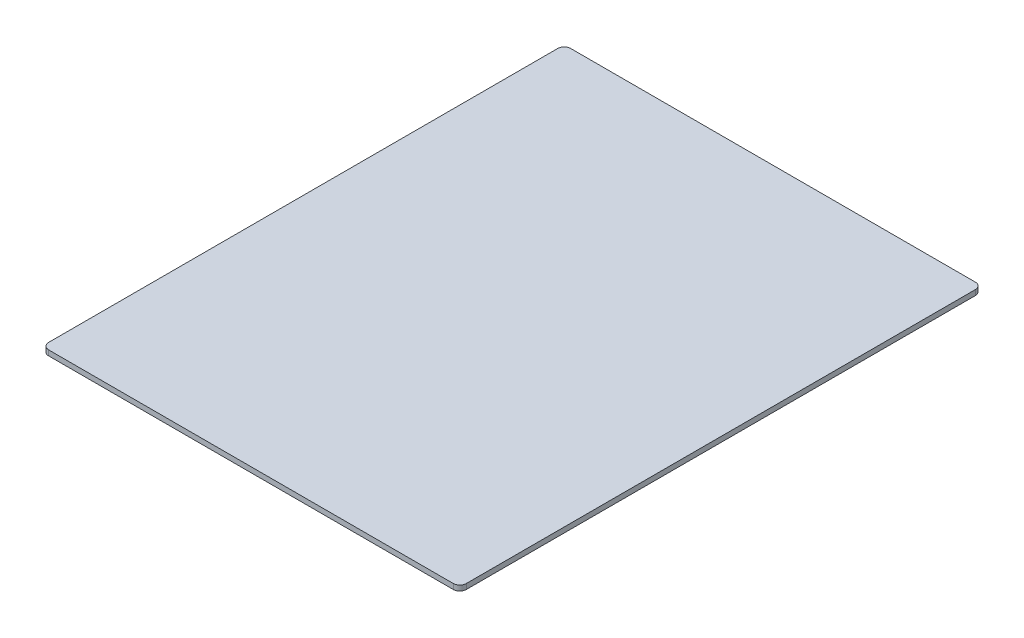
ISO-10303-21;
HEADER;
FILE_DESCRIPTION(('STEP AP214'),'2;1');
FILE_NAME('part.step','',(''),(''),'','','');
FILE_SCHEMA(('AUTOMOTIVE_DESIGN { 1 0 10303 214 1 1 1 1 }'));
ENDSEC;
DATA;
#1=APPLICATION_CONTEXT('core data for automotive mechanical design processes');
#2=APPLICATION_PROTOCOL_DEFINITION('international standard','automotive_design',2000,#1);
#3=PRODUCT_CONTEXT('',#1,'mechanical');
#4=PRODUCT('Part','Part','',(#3));
#5=PRODUCT_RELATED_PRODUCT_CATEGORY('part','',(#4));
#6=PRODUCT_DEFINITION_FORMATION('','',#4);
#7=PRODUCT_DEFINITION_CONTEXT('part definition',#1,'design');
#8=PRODUCT_DEFINITION('design','',#6,#7);
#9=PRODUCT_DEFINITION_SHAPE('','',#8);
#10=(LENGTH_UNIT() NAMED_UNIT(*) SI_UNIT(.MILLI.,.METRE.));
#11=(NAMED_UNIT(*) PLANE_ANGLE_UNIT() SI_UNIT($,.RADIAN.));
#12=(NAMED_UNIT(*) SI_UNIT($,.STERADIAN.) SOLID_ANGLE_UNIT());
#13=UNCERTAINTY_MEASURE_WITH_UNIT(LENGTH_MEASURE(1.E-05),#10,'distance_accuracy_value','');
#14=(GEOMETRIC_REPRESENTATION_CONTEXT(3) GLOBAL_UNCERTAINTY_ASSIGNED_CONTEXT((#13)) GLOBAL_UNIT_ASSIGNED_CONTEXT((#10,
#11,#12)) REPRESENTATION_CONTEXT('',''));
#15=CARTESIAN_POINT('',(0.,0.,0.));
#16=DIRECTION('',(0.,0.,1.));
#17=DIRECTION('',(1.,0.,0.));
#18=AXIS2_PLACEMENT_3D('',#15,#16,#17);
#19=CARTESIAN_POINT('',(-80.,2.,100.));
#20=DIRECTION('',(1.,0.,0.));
#21=DIRECTION('',(0.,0.,-1.));
#22=AXIS2_PLACEMENT_3D('',#19,#20,#21);
#23=PLANE('',#22);
#24=DIRECTION('',(0.,0.,1.));
#25=VECTOR('',#24,1.);
#26=CARTESIAN_POINT('',(-80.,2.,100.));
#27=LINE('',#26,#25);
#28=CARTESIAN_POINT('',(-80.,2.,-97.5));
#29=VERTEX_POINT('',#28);
#30=CARTESIAN_POINT('',(-80.,2.,97.5));
#31=VERTEX_POINT('',#30);
#32=EDGE_CURVE('E120',#29,#31,#27,.T.);
#33=ORIENTED_EDGE('',*,*,#32,.F.);
#34=DIRECTION('',(0.,-1.,0.));
#35=VECTOR('',#34,1.);
#36=CARTESIAN_POINT('',(-80.,2.,-97.5));
#37=LINE('',#36,#35);
#38=CARTESIAN_POINT('',(-80.,0.,-97.5));
#39=VERTEX_POINT('',#38);
#40=EDGE_CURVE('E105',#29,#39,#37,.T.);
#41=ORIENTED_EDGE('',*,*,#40,.T.);
#42=DIRECTION('',(0.,0.,1.));
#43=VECTOR('',#42,1.);
#44=CARTESIAN_POINT('',(-80.,0.,100.));
#45=LINE('',#44,#43);
#46=CARTESIAN_POINT('',(-80.,0.,97.5));
#47=VERTEX_POINT('',#46);
#48=EDGE_CURVE('E117',#39,#47,#45,.T.);
#49=ORIENTED_EDGE('',*,*,#48,.T.);
#50=DIRECTION('',(0.,-1.,0.));
#51=VECTOR('',#50,1.);
#52=CARTESIAN_POINT('',(-80.,2.,97.5));
#53=LINE('',#52,#51);
#54=EDGE_CURVE('E122',#47,#31,#53,.F.);
#55=ORIENTED_EDGE('',*,*,#54,.T.);
#56=EDGE_LOOP('',(#33,#41,#49,#55));
#57=FACE_BOUND('',#56,.T.);
#58=ADVANCED_FACE('F35',(#57),#23,.F.);
#59=CARTESIAN_POINT('',(80.,2.,100.));
#60=DIRECTION('',(0.,0.,-1.));
#61=DIRECTION('',(-1.,0.,0.));
#62=AXIS2_PLACEMENT_3D('',#59,#60,#61);
#63=PLANE('',#62);
#64=DIRECTION('',(1.,0.,0.));
#65=VECTOR('',#64,1.);
#66=CARTESIAN_POINT('',(80.,0.,100.));
#67=LINE('',#66,#65);
#68=CARTESIAN_POINT('',(-77.5,0.,100.));
#69=VERTEX_POINT('',#68);
#70=CARTESIAN_POINT('',(77.5,0.,100.));
#71=VERTEX_POINT('',#70);
#72=EDGE_CURVE('E126',#69,#71,#67,.T.);
#73=ORIENTED_EDGE('',*,*,#72,.T.);
#74=DIRECTION('',(0.,-1.,0.));
#75=VECTOR('',#74,1.);
#76=CARTESIAN_POINT('',(77.5,2.,100.));
#77=LINE('',#76,#75);
#78=CARTESIAN_POINT('',(77.5,2.,100.));
#79=VERTEX_POINT('',#78);
#80=EDGE_CURVE('E11',#71,#79,#77,.F.);
#81=ORIENTED_EDGE('',*,*,#80,.T.);
#82=DIRECTION('',(1.,0.,0.));
#83=VECTOR('',#82,1.);
#84=CARTESIAN_POINT('',(80.,2.,100.));
#85=LINE('',#84,#83);
#86=CARTESIAN_POINT('',(-77.5,2.,100.));
#87=VERTEX_POINT('',#86);
#88=EDGE_CURVE('E162',#87,#79,#85,.T.);
#89=ORIENTED_EDGE('',*,*,#88,.F.);
#90=DIRECTION('',(0.,-1.,0.));
#91=VECTOR('',#90,1.);
#92=CARTESIAN_POINT('',(-77.5,2.,100.));
#93=LINE('',#92,#91);
#94=EDGE_CURVE('E43',#87,#69,#93,.T.);
#95=ORIENTED_EDGE('',*,*,#94,.T.);
#96=EDGE_LOOP('',(#73,#81,#89,#95));
#97=FACE_BOUND('',#96,.T.);
#98=ADVANCED_FACE('F160',(#97),#63,.F.);
#99=CARTESIAN_POINT('',(80.,2.,100.));
#100=DIRECTION('',(-1.,0.,0.));
#101=DIRECTION('',(0.,0.,1.));
#102=AXIS2_PLACEMENT_3D('',#99,#100,#101);
#103=PLANE('',#102);
#104=DIRECTION('',(0.,0.,-1.));
#105=VECTOR('',#104,1.);
#106=CARTESIAN_POINT('',(80.,0.,100.));
#107=LINE('',#106,#105);
#108=CARTESIAN_POINT('',(80.,0.,97.5));
#109=VERTEX_POINT('',#108);
#110=CARTESIAN_POINT('',(80.,0.,-97.5));
#111=VERTEX_POINT('',#110);
#112=EDGE_CURVE('E129',#109,#111,#107,.T.);
#113=ORIENTED_EDGE('',*,*,#112,.T.);
#114=DIRECTION('',(0.,-1.,0.));
#115=VECTOR('',#114,1.);
#116=CARTESIAN_POINT('',(80.,2.,-97.5));
#117=LINE('',#116,#115);
#118=CARTESIAN_POINT('',(80.,2.,-97.5));
#119=VERTEX_POINT('',#118);
#120=EDGE_CURVE('E50',#111,#119,#117,.F.);
#121=ORIENTED_EDGE('',*,*,#120,.T.);
#122=DIRECTION('',(0.,0.,-1.));
#123=VECTOR('',#122,1.);
#124=CARTESIAN_POINT('',(80.,2.,100.));
#125=LINE('',#124,#123);
#126=CARTESIAN_POINT('',(80.,2.,97.5));
#127=VERTEX_POINT('',#126);
#128=EDGE_CURVE('E170',#127,#119,#125,.T.);
#129=ORIENTED_EDGE('',*,*,#128,.F.);
#130=DIRECTION('',(0.,-1.,0.));
#131=VECTOR('',#130,1.);
#132=CARTESIAN_POINT('',(80.,2.,97.5));
#133=LINE('',#132,#131);
#134=EDGE_CURVE('E153',#127,#109,#133,.T.);
#135=ORIENTED_EDGE('',*,*,#134,.T.);
#136=EDGE_LOOP('',(#113,#121,#129,#135));
#137=FACE_BOUND('',#136,.T.);
#138=ADVANCED_FACE('F169',(#137),#103,.F.);
#139=CARTESIAN_POINT('',(80.,2.,-100.));
#140=DIRECTION('',(0.,0.,1.));
#141=DIRECTION('',(1.,0.,0.));
#142=AXIS2_PLACEMENT_3D('',#139,#140,#141);
#143=PLANE('',#142);
#144=DIRECTION('',(-1.,0.,0.));
#145=VECTOR('',#144,1.);
#146=CARTESIAN_POINT('',(80.,0.,-100.));
#147=LINE('',#146,#145);
#148=CARTESIAN_POINT('',(77.5,0.,-100.));
#149=VERTEX_POINT('',#148);
#150=CARTESIAN_POINT('',(-77.5,0.,-100.));
#151=VERTEX_POINT('',#150);
#152=EDGE_CURVE('E136',#149,#151,#147,.T.);
#153=ORIENTED_EDGE('',*,*,#152,.T.);
#154=DIRECTION('',(0.,-1.,0.));
#155=VECTOR('',#154,1.);
#156=CARTESIAN_POINT('',(-77.5,2.,-100.));
#157=LINE('',#156,#155);
#158=CARTESIAN_POINT('',(-77.5,2.,-100.));
#159=VERTEX_POINT('',#158);
#160=EDGE_CURVE('E106',#151,#159,#157,.F.);
#161=ORIENTED_EDGE('',*,*,#160,.T.);
#162=DIRECTION('',(-1.,0.,0.));
#163=VECTOR('',#162,1.);
#164=CARTESIAN_POINT('',(80.,2.,-100.));
#165=LINE('',#164,#163);
#166=CARTESIAN_POINT('',(77.5,2.,-100.));
#167=VERTEX_POINT('',#166);
#168=EDGE_CURVE('E132',#167,#159,#165,.T.);
#169=ORIENTED_EDGE('',*,*,#168,.F.);
#170=DIRECTION('',(0.,-1.,0.));
#171=VECTOR('',#170,1.);
#172=CARTESIAN_POINT('',(77.5,2.,-100.));
#173=LINE('',#172,#171);
#174=EDGE_CURVE('E111',#167,#149,#173,.T.);
#175=ORIENTED_EDGE('',*,*,#174,.T.);
#176=EDGE_LOOP('',(#153,#161,#169,#175));
#177=FACE_BOUND('',#176,.T.);
#178=ADVANCED_FACE('F198',(#177),#143,.F.);
#179=CARTESIAN_POINT('',(0.,2.,0.));
#180=DIRECTION('',(0.,1.,0.));
#181=DIRECTION('',(0.,0.,1.));
#182=AXIS2_PLACEMENT_3D('',#179,#180,#181);
#183=PLANE('',#182);
#184=ORIENTED_EDGE('',*,*,#168,.T.);
#185=CARTESIAN_POINT('',(-77.5,2.,-97.5));
#186=DIRECTION('',(0.,1.,0.));
#187=DIRECTION('',(0.,0.,1.));
#188=AXIS2_PLACEMENT_3D('',#185,#186,#187);
#189=CIRCLE('',#188,2.5);
#190=EDGE_CURVE('E151',#159,#29,#189,.T.);
#191=ORIENTED_EDGE('',*,*,#190,.T.);
#192=ORIENTED_EDGE('',*,*,#32,.T.);
#193=CARTESIAN_POINT('',(-77.5,2.,97.5));
#194=DIRECTION('',(0.,1.,0.));
#195=DIRECTION('',(0.,0.,1.));
#196=AXIS2_PLACEMENT_3D('',#193,#194,#195);
#197=CIRCLE('',#196,2.5);
#198=EDGE_CURVE('E146',#31,#87,#197,.T.);
#199=ORIENTED_EDGE('',*,*,#198,.T.);
#200=ORIENTED_EDGE('',*,*,#88,.T.);
#201=CARTESIAN_POINT('',(77.5,2.,97.5));
#202=DIRECTION('',(0.,1.,0.));
#203=DIRECTION('',(0.,0.,1.));
#204=AXIS2_PLACEMENT_3D('',#201,#202,#203);
#205=CIRCLE('',#204,2.5);
#206=EDGE_CURVE('E57',#79,#127,#205,.T.);
#207=ORIENTED_EDGE('',*,*,#206,.T.);
#208=ORIENTED_EDGE('',*,*,#128,.T.);
#209=CARTESIAN_POINT('',(77.5,2.,-97.5));
#210=DIRECTION('',(0.,1.,0.));
#211=DIRECTION('',(0.,0.,1.));
#212=AXIS2_PLACEMENT_3D('',#209,#210,#211);
#213=CIRCLE('',#212,2.5);
#214=EDGE_CURVE('E149',#119,#167,#213,.T.);
#215=ORIENTED_EDGE('',*,*,#214,.T.);
#216=EDGE_LOOP('',(#184,#191,#192,#199,#200,#207,#208,#215));
#217=FACE_BOUND('',#216,.T.);
#218=ADVANCED_FACE('F175',(#217),#183,.T.);
#219=CARTESIAN_POINT('',(0.,0.,0.));
#220=DIRECTION('',(0.,1.,0.));
#221=DIRECTION('',(0.,0.,1.));
#222=AXIS2_PLACEMENT_3D('',#219,#220,#221);
#223=PLANE('',#222);
#224=ORIENTED_EDGE('',*,*,#48,.F.);
#225=CARTESIAN_POINT('',(-77.5,0.,-97.5));
#226=DIRECTION('',(0.,1.,0.));
#227=DIRECTION('',(0.,0.,1.));
#228=AXIS2_PLACEMENT_3D('',#225,#226,#227);
#229=CIRCLE('',#228,2.5);
#230=EDGE_CURVE('E101',#39,#151,#229,.F.);
#231=ORIENTED_EDGE('',*,*,#230,.T.);
#232=ORIENTED_EDGE('',*,*,#152,.F.);
#233=CARTESIAN_POINT('',(77.5,0.,-97.5));
#234=DIRECTION('',(0.,1.,0.));
#235=DIRECTION('',(0.,0.,1.));
#236=AXIS2_PLACEMENT_3D('',#233,#234,#235);
#237=CIRCLE('',#236,2.5);
#238=EDGE_CURVE('E112',#149,#111,#237,.F.);
#239=ORIENTED_EDGE('',*,*,#238,.T.);
#240=ORIENTED_EDGE('',*,*,#112,.F.);
#241=CARTESIAN_POINT('',(77.5,0.,97.5));
#242=DIRECTION('',(0.,1.,0.));
#243=DIRECTION('',(0.,0.,1.));
#244=AXIS2_PLACEMENT_3D('',#241,#242,#243);
#245=CIRCLE('',#244,2.5);
#246=EDGE_CURVE('E140',#109,#71,#245,.F.);
#247=ORIENTED_EDGE('',*,*,#246,.T.);
#248=ORIENTED_EDGE('',*,*,#72,.F.);
#249=CARTESIAN_POINT('',(-77.5,0.,97.5));
#250=DIRECTION('',(0.,1.,0.));
#251=DIRECTION('',(0.,0.,1.));
#252=AXIS2_PLACEMENT_3D('',#249,#250,#251);
#253=CIRCLE('',#252,2.5);
#254=EDGE_CURVE('E121',#69,#47,#253,.F.);
#255=ORIENTED_EDGE('',*,*,#254,.T.);
#256=EDGE_LOOP('',(#224,#231,#232,#239,#240,#247,#248,#255));
#257=FACE_BOUND('',#256,.T.);
#258=ADVANCED_FACE('F124',(#257),#223,.F.);
#259=CARTESIAN_POINT('',(-77.5,2.,-97.5));
#260=DIRECTION('',(0.,-1.,0.));
#261=DIRECTION('',(0.,0.,-1.));
#262=AXIS2_PLACEMENT_3D('',#259,#260,#261);
#263=CYLINDRICAL_SURFACE('',#262,2.5);
#264=ORIENTED_EDGE('',*,*,#190,.F.);
#265=ORIENTED_EDGE('',*,*,#160,.F.);
#266=ORIENTED_EDGE('',*,*,#230,.F.);
#267=ORIENTED_EDGE('',*,*,#40,.F.);
#268=EDGE_LOOP('',(#264,#265,#266,#267));
#269=FACE_BOUND('',#268,.T.);
#270=ADVANCED_FACE('F104',(#269),#263,.T.);
#271=CARTESIAN_POINT('',(77.5,2.,-97.5));
#272=DIRECTION('',(0.,-1.,0.));
#273=DIRECTION('',(0.,0.,-1.));
#274=AXIS2_PLACEMENT_3D('',#271,#272,#273);
#275=CYLINDRICAL_SURFACE('',#274,2.5);
#276=ORIENTED_EDGE('',*,*,#214,.F.);
#277=ORIENTED_EDGE('',*,*,#120,.F.);
#278=ORIENTED_EDGE('',*,*,#238,.F.);
#279=ORIENTED_EDGE('',*,*,#174,.F.);
#280=EDGE_LOOP('',(#276,#277,#278,#279));
#281=FACE_BOUND('',#280,.T.);
#282=ADVANCED_FACE('F180',(#281),#275,.T.);
#283=CARTESIAN_POINT('',(77.5,2.,97.5));
#284=DIRECTION('',(0.,-1.,0.));
#285=DIRECTION('',(0.,0.,-1.));
#286=AXIS2_PLACEMENT_3D('',#283,#284,#285);
#287=CYLINDRICAL_SURFACE('',#286,2.5);
#288=ORIENTED_EDGE('',*,*,#206,.F.);
#289=ORIENTED_EDGE('',*,*,#80,.F.);
#290=ORIENTED_EDGE('',*,*,#246,.F.);
#291=ORIENTED_EDGE('',*,*,#134,.F.);
#292=EDGE_LOOP('',(#288,#289,#290,#291));
#293=FACE_BOUND('',#292,.T.);
#294=ADVANCED_FACE('F168',(#293),#287,.T.);
#295=CARTESIAN_POINT('',(-77.5,2.,97.5));
#296=DIRECTION('',(0.,-1.,0.));
#297=DIRECTION('',(0.,0.,-1.));
#298=AXIS2_PLACEMENT_3D('',#295,#296,#297);
#299=CYLINDRICAL_SURFACE('',#298,2.5);
#300=ORIENTED_EDGE('',*,*,#198,.F.);
#301=ORIENTED_EDGE('',*,*,#54,.F.);
#302=ORIENTED_EDGE('',*,*,#254,.F.);
#303=ORIENTED_EDGE('',*,*,#94,.F.);
#304=EDGE_LOOP('',(#300,#301,#302,#303));
#305=FACE_BOUND('',#304,.T.);
#306=ADVANCED_FACE('F37',(#305),#299,.T.);
#307=CLOSED_SHELL('',(#58,#98,#138,#178,#218,#258,#270,#282,#294,#306));
#308=MANIFOLD_SOLID_BREP('B2',#307);
#309=ADVANCED_BREP_SHAPE_REPRESENTATION('',(#18,#308),#14);
#310=SHAPE_DEFINITION_REPRESENTATION(#9,#309);
ENDSEC;
END-ISO-10303-21;
